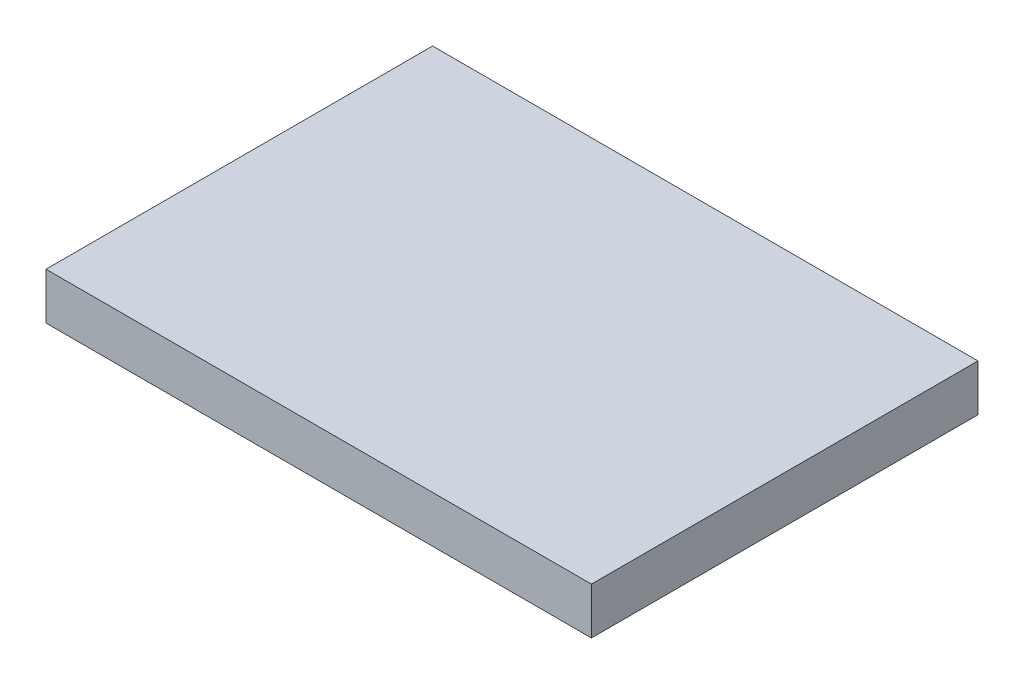
ISO-10303-21;
HEADER;
FILE_DESCRIPTION(('STEP AP214'),'2;1');
FILE_NAME('part.step','',(''),(''),'','','');
FILE_SCHEMA(('AUTOMOTIVE_DESIGN { 1 0 10303 214 1 1 1 1 }'));
ENDSEC;
DATA;
#1=APPLICATION_CONTEXT('core data for automotive mechanical design processes');
#2=APPLICATION_PROTOCOL_DEFINITION('international standard','automotive_design',2000,#1);
#3=PRODUCT_CONTEXT('',#1,'mechanical');
#4=PRODUCT('Part','Part','',(#3));
#5=PRODUCT_RELATED_PRODUCT_CATEGORY('part','',(#4));
#6=PRODUCT_DEFINITION_FORMATION('','',#4);
#7=PRODUCT_DEFINITION_CONTEXT('part definition',#1,'design');
#8=PRODUCT_DEFINITION('design','',#6,#7);
#9=PRODUCT_DEFINITION_SHAPE('','',#8);
#10=(LENGTH_UNIT() NAMED_UNIT(*) SI_UNIT(.MILLI.,.METRE.));
#11=(NAMED_UNIT(*) PLANE_ANGLE_UNIT() SI_UNIT($,.RADIAN.));
#12=(NAMED_UNIT(*) SI_UNIT($,.STERADIAN.) SOLID_ANGLE_UNIT());
#13=UNCERTAINTY_MEASURE_WITH_UNIT(LENGTH_MEASURE(1.E-05),#10,'distance_accuracy_value','');
#14=(GEOMETRIC_REPRESENTATION_CONTEXT(3) GLOBAL_UNCERTAINTY_ASSIGNED_CONTEXT((#13)) GLOBAL_UNIT_ASSIGNED_CONTEXT((#10,
#11,#12)) REPRESENTATION_CONTEXT('',''));
#15=CARTESIAN_POINT('',(0.,0.,0.));
#16=DIRECTION('',(0.,0.,1.));
#17=DIRECTION('',(1.,0.,0.));
#18=AXIS2_PLACEMENT_3D('',#15,#16,#17);
#19=CARTESIAN_POINT('',(150.,0.,0.));
#20=DIRECTION('',(0.,0.,-1.));
#21=DIRECTION('',(-1.,0.,0.));
#22=AXIS2_PLACEMENT_3D('',#19,#20,#21);
#23=PLANE('',#22);
#24=DIRECTION('',(0.,-1.,0.));
#25=VECTOR('',#24,1.);
#26=CARTESIAN_POINT('',(0.,0.,0.));
#27=LINE('',#26,#25);
#28=CARTESIAN_POINT('',(0.,12.8276703779306,0.));
#29=VERTEX_POINT('',#28);
#30=CARTESIAN_POINT('',(0.,0.,0.));
#31=VERTEX_POINT('',#30);
#32=EDGE_CURVE('E96',#29,#31,#27,.T.);
#33=ORIENTED_EDGE('',*,*,#32,.T.);
#34=DIRECTION('',(-1.,0.,0.));
#35=VECTOR('',#34,1.);
#36=CARTESIAN_POINT('',(150.,0.,0.));
#37=LINE('',#36,#35);
#38=CARTESIAN_POINT('',(150.,0.,0.));
#39=VERTEX_POINT('',#38);
#40=EDGE_CURVE('E11',#39,#31,#37,.T.);
#41=ORIENTED_EDGE('',*,*,#40,.F.);
#42=DIRECTION('',(0.,-1.,0.));
#43=VECTOR('',#42,1.);
#44=CARTESIAN_POINT('',(150.,0.,0.));
#45=LINE('',#44,#43);
#46=CARTESIAN_POINT('',(150.,12.8276703779306,0.));
#47=VERTEX_POINT('',#46);
#48=EDGE_CURVE('E84',#47,#39,#45,.T.);
#49=ORIENTED_EDGE('',*,*,#48,.F.);
#50=DIRECTION('',(-1.,0.,0.));
#51=VECTOR('',#50,1.);
#52=CARTESIAN_POINT('',(150.,12.8276703779306,0.));
#53=LINE('',#52,#51);
#54=EDGE_CURVE('E92',#47,#29,#53,.T.);
#55=ORIENTED_EDGE('',*,*,#54,.T.);
#56=EDGE_LOOP('',(#33,#41,#49,#55));
#57=FACE_BOUND('',#56,.T.);
#58=ADVANCED_FACE('F33',(#57),#23,.F.);
#59=CARTESIAN_POINT('',(150.,0.,0.));
#60=DIRECTION('',(0.,1.,0.));
#61=DIRECTION('',(0.,0.,1.));
#62=AXIS2_PLACEMENT_3D('',#59,#60,#61);
#63=PLANE('',#62);
#64=DIRECTION('',(0.,0.,-1.));
#65=VECTOR('',#64,1.);
#66=CARTESIAN_POINT('',(0.,0.,0.));
#67=LINE('',#66,#65);
#68=CARTESIAN_POINT('',(0.,0.,-106.314849721338));
#69=VERTEX_POINT('',#68);
#70=EDGE_CURVE('E88',#31,#69,#67,.T.);
#71=ORIENTED_EDGE('',*,*,#70,.T.);
#72=DIRECTION('',(-1.,0.,0.));
#73=VECTOR('',#72,1.);
#74=CARTESIAN_POINT('',(150.,0.,-106.314849721338));
#75=LINE('',#74,#73);
#76=CARTESIAN_POINT('',(150.,0.,-106.314849721338));
#77=VERTEX_POINT('',#76);
#78=EDGE_CURVE('E41',#77,#69,#75,.T.);
#79=ORIENTED_EDGE('',*,*,#78,.F.);
#80=DIRECTION('',(0.,0.,-1.));
#81=VECTOR('',#80,1.);
#82=CARTESIAN_POINT('',(150.,0.,0.));
#83=LINE('',#82,#81);
#84=EDGE_CURVE('E79',#39,#77,#83,.T.);
#85=ORIENTED_EDGE('',*,*,#84,.F.);
#86=ORIENTED_EDGE('',*,*,#40,.T.);
#87=EDGE_LOOP('',(#71,#79,#85,#86));
#88=FACE_BOUND('',#87,.T.);
#89=ADVANCED_FACE('F87',(#88),#63,.F.);
#90=CARTESIAN_POINT('',(150.,0.,-106.314849721338));
#91=DIRECTION('',(0.,0.,1.));
#92=DIRECTION('',(1.,0.,0.));
#93=AXIS2_PLACEMENT_3D('',#90,#91,#92);
#94=PLANE('',#93);
#95=DIRECTION('',(0.,1.,0.));
#96=VECTOR('',#95,1.);
#97=CARTESIAN_POINT('',(0.,0.,-106.314849721338));
#98=LINE('',#97,#96);
#99=CARTESIAN_POINT('',(0.,12.8276703779306,-106.314849721338));
#100=VERTEX_POINT('',#99);
#101=EDGE_CURVE('E66',#69,#100,#98,.T.);
#102=ORIENTED_EDGE('',*,*,#101,.T.);
#103=DIRECTION('',(-1.,0.,0.));
#104=VECTOR('',#103,1.);
#105=CARTESIAN_POINT('',(150.,12.8276703779306,-106.314849721338));
#106=LINE('',#105,#104);
#107=CARTESIAN_POINT('',(150.,12.8276703779306,-106.314849721338));
#108=VERTEX_POINT('',#107);
#109=EDGE_CURVE('E89',#108,#100,#106,.T.);
#110=ORIENTED_EDGE('',*,*,#109,.F.);
#111=DIRECTION('',(0.,1.,0.));
#112=VECTOR('',#111,1.);
#113=CARTESIAN_POINT('',(150.,0.,-106.314849721338));
#114=LINE('',#113,#112);
#115=EDGE_CURVE('E82',#77,#108,#114,.T.);
#116=ORIENTED_EDGE('',*,*,#115,.F.);
#117=ORIENTED_EDGE('',*,*,#78,.T.);
#118=EDGE_LOOP('',(#102,#110,#116,#117));
#119=FACE_BOUND('',#118,.T.);
#120=ADVANCED_FACE('F90',(#119),#94,.F.);
#121=CARTESIAN_POINT('',(150.,12.8276703779306,0.));
#122=DIRECTION('',(0.,-1.,0.));
#123=DIRECTION('',(0.,0.,-1.));
#124=AXIS2_PLACEMENT_3D('',#121,#122,#123);
#125=PLANE('',#124);
#126=DIRECTION('',(0.,0.,1.));
#127=VECTOR('',#126,1.);
#128=CARTESIAN_POINT('',(0.,12.8276703779306,0.));
#129=LINE('',#128,#127);
#130=EDGE_CURVE('E72',#100,#29,#129,.T.);
#131=ORIENTED_EDGE('',*,*,#130,.T.);
#132=ORIENTED_EDGE('',*,*,#54,.F.);
#133=DIRECTION('',(0.,0.,1.));
#134=VECTOR('',#133,1.);
#135=CARTESIAN_POINT('',(150.,12.8276703779306,0.));
#136=LINE('',#135,#134);
#137=EDGE_CURVE('E49',#108,#47,#136,.T.);
#138=ORIENTED_EDGE('',*,*,#137,.F.);
#139=ORIENTED_EDGE('',*,*,#109,.T.);
#140=EDGE_LOOP('',(#131,#132,#138,#139));
#141=FACE_BOUND('',#140,.T.);
#142=ADVANCED_FACE('F103',(#141),#125,.F.);
#143=CARTESIAN_POINT('',(150.,12.8276703779306,0.));
#144=DIRECTION('',(-1.,0.,0.));
#145=DIRECTION('',(0.,0.,1.));
#146=AXIS2_PLACEMENT_3D('',#143,#144,#145);
#147=PLANE('',#146);
#148=ORIENTED_EDGE('',*,*,#48,.T.);
#149=ORIENTED_EDGE('',*,*,#84,.T.);
#150=ORIENTED_EDGE('',*,*,#115,.T.);
#151=ORIENTED_EDGE('',*,*,#137,.T.);
#152=EDGE_LOOP('',(#148,#149,#150,#151));
#153=FACE_BOUND('',#152,.T.);
#154=ADVANCED_FACE('F80',(#153),#147,.F.);
#155=CARTESIAN_POINT('',(0.,12.8276703779306,0.));
#156=DIRECTION('',(-1.,0.,0.));
#157=DIRECTION('',(0.,0.,1.));
#158=AXIS2_PLACEMENT_3D('',#155,#156,#157);
#159=PLANE('',#158);
#160=ORIENTED_EDGE('',*,*,#32,.F.);
#161=ORIENTED_EDGE('',*,*,#130,.F.);
#162=ORIENTED_EDGE('',*,*,#101,.F.);
#163=ORIENTED_EDGE('',*,*,#70,.F.);
#164=EDGE_LOOP('',(#160,#161,#162,#163));
#165=FACE_BOUND('',#164,.T.);
#166=ADVANCED_FACE('F106',(#165),#159,.T.);
#167=CLOSED_SHELL('',(#58,#89,#120,#142,#154,#166));
#168=MANIFOLD_SOLID_BREP('B2',#167);
#169=ADVANCED_BREP_SHAPE_REPRESENTATION('',(#18,#168),#14);
#170=SHAPE_DEFINITION_REPRESENTATION(#9,#169);
ENDSEC;
END-ISO-10303-21;
